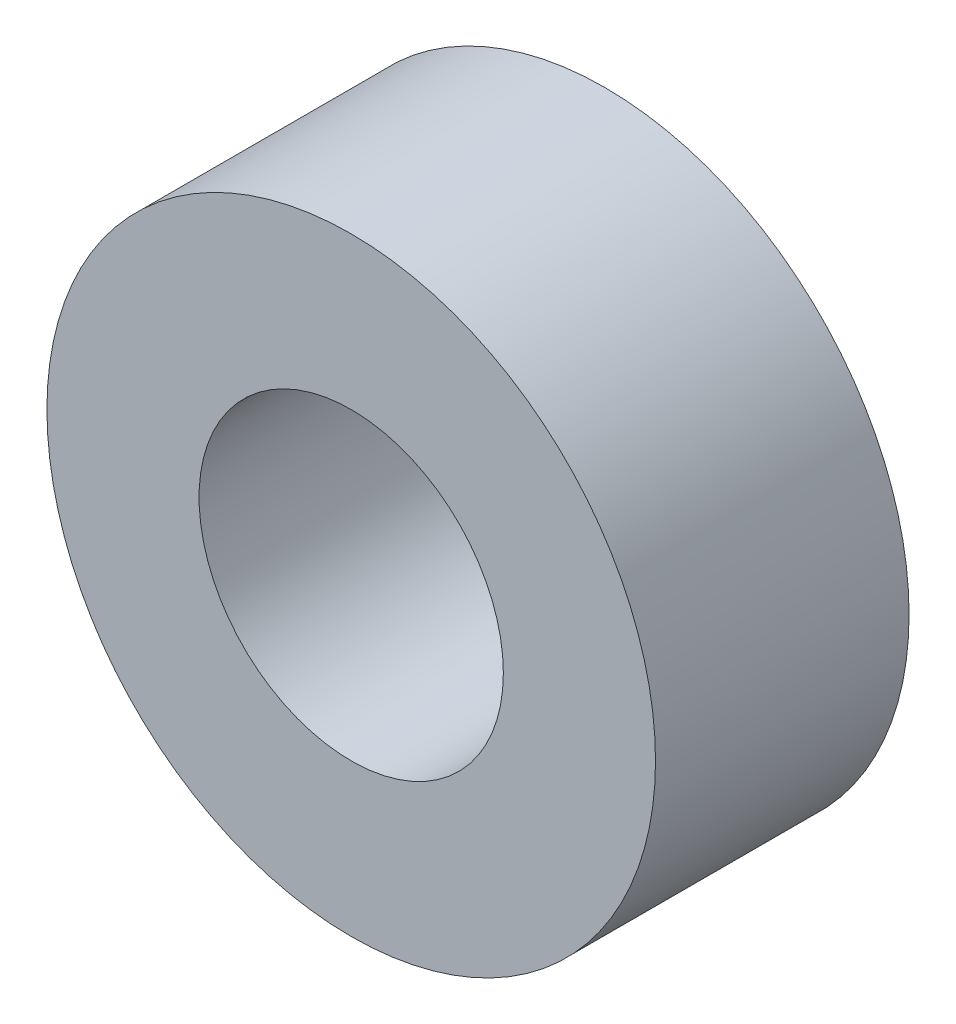
ISO-10303-21;
HEADER;
FILE_DESCRIPTION(('STEP AP214'),'2;1');
FILE_NAME('part.step','',(''),(''),'','','');
FILE_SCHEMA(('AUTOMOTIVE_DESIGN { 1 0 10303 214 1 1 1 1 }'));
ENDSEC;
DATA;
#1=APPLICATION_CONTEXT('core data for automotive mechanical design processes');
#2=APPLICATION_PROTOCOL_DEFINITION('international standard','automotive_design',2000,#1);
#3=PRODUCT_CONTEXT('',#1,'mechanical');
#4=PRODUCT('Part','Part','',(#3));
#5=PRODUCT_RELATED_PRODUCT_CATEGORY('part','',(#4));
#6=PRODUCT_DEFINITION_FORMATION('','',#4);
#7=PRODUCT_DEFINITION_CONTEXT('part definition',#1,'design');
#8=PRODUCT_DEFINITION('design','',#6,#7);
#9=PRODUCT_DEFINITION_SHAPE('','',#8);
#10=(LENGTH_UNIT() NAMED_UNIT(*) SI_UNIT(.MILLI.,.METRE.));
#11=(NAMED_UNIT(*) PLANE_ANGLE_UNIT() SI_UNIT($,.RADIAN.));
#12=(NAMED_UNIT(*) SI_UNIT($,.STERADIAN.) SOLID_ANGLE_UNIT());
#13=UNCERTAINTY_MEASURE_WITH_UNIT(LENGTH_MEASURE(1.E-05),#10,'distance_accuracy_value','');
#14=(GEOMETRIC_REPRESENTATION_CONTEXT(3) GLOBAL_UNCERTAINTY_ASSIGNED_CONTEXT((#13)) GLOBAL_UNIT_ASSIGNED_CONTEXT((#10,
#11,#12)) REPRESENTATION_CONTEXT('',''));
#15=CARTESIAN_POINT('',(0.,0.,0.));
#16=DIRECTION('',(0.,0.,1.));
#17=DIRECTION('',(1.,0.,0.));
#18=AXIS2_PLACEMENT_3D('',#15,#16,#17);
#19=CARTESIAN_POINT('',(0.,0.,5.));
#20=DIRECTION('',(0.,0.,1.));
#21=DIRECTION('',(1.,0.,0.));
#22=AXIS2_PLACEMENT_3D('',#19,#20,#21);
#23=PLANE('',#22);
#24=CARTESIAN_POINT('',(0.,0.,5.));
#25=DIRECTION('',(0.,0.,1.));
#26=DIRECTION('',(1.,0.,0.));
#27=AXIS2_PLACEMENT_3D('',#24,#25,#26);
#28=CIRCLE('',#27,6.);
#29=CARTESIAN_POINT('',(6.,0.,5.));
#30=VERTEX_POINT('',#29);
#31=EDGE_CURVE('E10',#30,#30,#28,.T.);
#32=ORIENTED_EDGE('',*,*,#31,.T.);
#33=EDGE_LOOP('',(#32));
#34=FACE_BOUND('',#33,.T.);
#35=CARTESIAN_POINT('',(0.,0.,5.));
#36=DIRECTION('',(0.,0.,1.));
#37=DIRECTION('',(1.,0.,0.));
#38=AXIS2_PLACEMENT_3D('',#35,#36,#37);
#39=CIRCLE('',#38,3.);
#40=CARTESIAN_POINT('',(3.,0.,5.));
#41=VERTEX_POINT('',#40);
#42=EDGE_CURVE('E56',#41,#41,#39,.T.);
#43=ORIENTED_EDGE('',*,*,#42,.F.);
#44=EDGE_LOOP('',(#43));
#45=FACE_BOUND('',#44,.T.);
#46=ADVANCED_FACE('F43',(#34,#45),#23,.T.);
#47=CARTESIAN_POINT('',(0.,0.,0.));
#48=DIRECTION('',(0.,0.,1.));
#49=DIRECTION('',(1.,0.,0.));
#50=AXIS2_PLACEMENT_3D('',#47,#48,#49);
#51=PLANE('',#50);
#52=CARTESIAN_POINT('',(0.,0.,0.));
#53=DIRECTION('',(0.,0.,1.));
#54=DIRECTION('',(1.,0.,0.));
#55=AXIS2_PLACEMENT_3D('',#52,#53,#54);
#56=CIRCLE('',#55,6.);
#57=CARTESIAN_POINT('',(6.,0.,0.));
#58=VERTEX_POINT('',#57);
#59=EDGE_CURVE('E47',#58,#58,#56,.T.);
#60=ORIENTED_EDGE('',*,*,#59,.F.);
#61=EDGE_LOOP('',(#60));
#62=FACE_BOUND('',#61,.T.);
#63=CARTESIAN_POINT('',(0.,0.,0.));
#64=DIRECTION('',(0.,0.,1.));
#65=DIRECTION('',(1.,0.,0.));
#66=AXIS2_PLACEMENT_3D('',#63,#64,#65);
#67=CIRCLE('',#66,3.);
#68=CARTESIAN_POINT('',(3.,0.,0.));
#69=VERTEX_POINT('',#68);
#70=EDGE_CURVE('E58',#69,#69,#67,.T.);
#71=ORIENTED_EDGE('',*,*,#70,.T.);
#72=EDGE_LOOP('',(#71));
#73=FACE_BOUND('',#72,.T.);
#74=ADVANCED_FACE('F70',(#62,#73),#51,.F.);
#75=CARTESIAN_POINT('',(0.,0.,5.));
#76=DIRECTION('',(0.,0.,-1.));
#77=DIRECTION('',(-1.,0.,0.));
#78=AXIS2_PLACEMENT_3D('',#75,#76,#77);
#79=CYLINDRICAL_SURFACE('',#78,6.);
#80=ORIENTED_EDGE('',*,*,#31,.F.);
#81=EDGE_LOOP('',(#80));
#82=FACE_BOUND('',#81,.T.);
#83=ORIENTED_EDGE('',*,*,#59,.T.);
#84=EDGE_LOOP('',(#83));
#85=FACE_BOUND('',#84,.T.);
#86=ADVANCED_FACE('F45',(#82,#85),#79,.T.);
#87=CARTESIAN_POINT('',(0.,0.,5.));
#88=DIRECTION('',(0.,0.,-1.));
#89=DIRECTION('',(-1.,0.,0.));
#90=AXIS2_PLACEMENT_3D('',#87,#88,#89);
#91=CYLINDRICAL_SURFACE('',#90,3.);
#92=ORIENTED_EDGE('',*,*,#42,.T.);
#93=EDGE_LOOP('',(#92));
#94=FACE_BOUND('',#93,.T.);
#95=ORIENTED_EDGE('',*,*,#70,.F.);
#96=EDGE_LOOP('',(#95));
#97=FACE_BOUND('',#96,.T.);
#98=ADVANCED_FACE('F66',(#94,#97),#91,.F.);
#99=CLOSED_SHELL('',(#46,#74,#86,#98));
#100=MANIFOLD_SOLID_BREP('B2',#99);
#101=ADVANCED_BREP_SHAPE_REPRESENTATION('',(#18,#100),#14);
#102=SHAPE_DEFINITION_REPRESENTATION(#9,#101);
ENDSEC;
END-ISO-10303-21;
